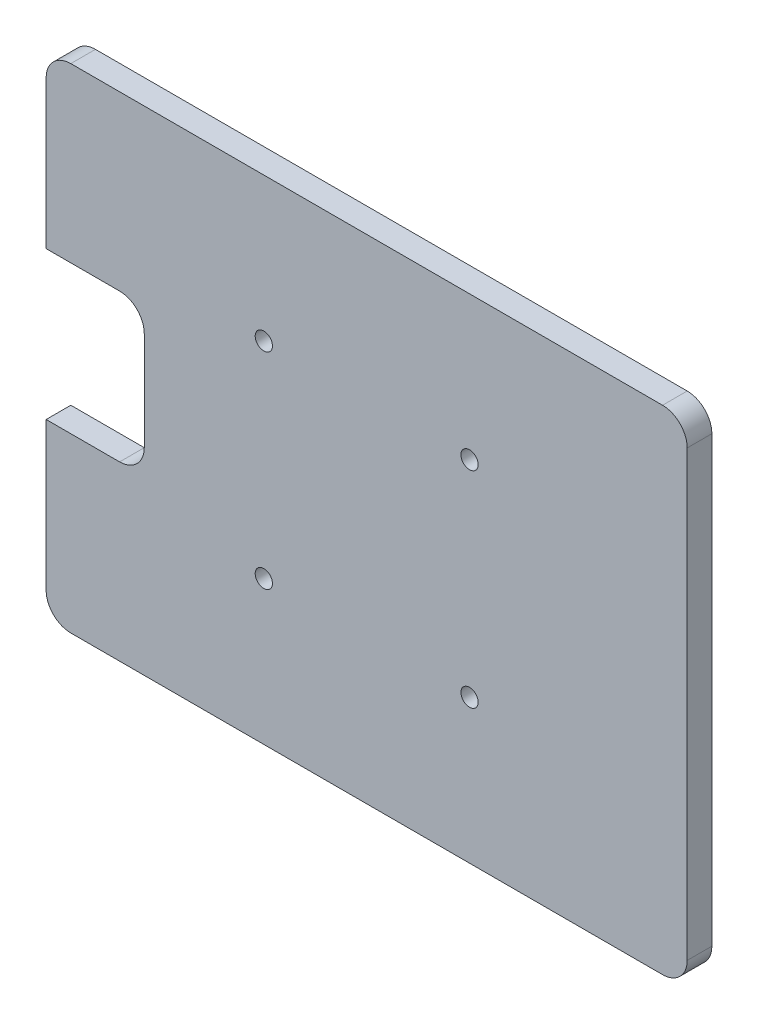
ISO-10303-21;
HEADER;
FILE_DESCRIPTION(('STEP AP214'),'2;1');
FILE_NAME('part.step','',(''),(''),'','','');
FILE_SCHEMA(('AUTOMOTIVE_DESIGN { 1 0 10303 214 1 1 1 1 }'));
ENDSEC;
DATA;
#1=APPLICATION_CONTEXT('core data for automotive mechanical design processes');
#2=APPLICATION_PROTOCOL_DEFINITION('international standard','automotive_design',2000,#1);
#3=PRODUCT_CONTEXT('',#1,'mechanical');
#4=PRODUCT('Part','Part','',(#3));
#5=PRODUCT_RELATED_PRODUCT_CATEGORY('part','',(#4));
#6=PRODUCT_DEFINITION_FORMATION('','',#4);
#7=PRODUCT_DEFINITION_CONTEXT('part definition',#1,'design');
#8=PRODUCT_DEFINITION('design','',#6,#7);
#9=PRODUCT_DEFINITION_SHAPE('','',#8);
#10=(LENGTH_UNIT() NAMED_UNIT(*) SI_UNIT(.MILLI.,.METRE.));
#11=(NAMED_UNIT(*) PLANE_ANGLE_UNIT() SI_UNIT($,.RADIAN.));
#12=(NAMED_UNIT(*) SI_UNIT($,.STERADIAN.) SOLID_ANGLE_UNIT());
#13=UNCERTAINTY_MEASURE_WITH_UNIT(LENGTH_MEASURE(1.E-05),#10,'distance_accuracy_value','');
#14=(GEOMETRIC_REPRESENTATION_CONTEXT(3) GLOBAL_UNCERTAINTY_ASSIGNED_CONTEXT((#13)) GLOBAL_UNIT_ASSIGNED_CONTEXT((#10,
#11,#12)) REPRESENTATION_CONTEXT('',''));
#15=CARTESIAN_POINT('',(0.,0.,0.));
#16=DIRECTION('',(0.,0.,1.));
#17=DIRECTION('',(1.,0.,0.));
#18=AXIS2_PLACEMENT_3D('',#15,#16,#17);
#19=CARTESIAN_POINT('',(-76.008064516129,52.6814516129032,5.));
#20=DIRECTION('',(1.,0.,0.));
#21=DIRECTION('',(0.,0.,-1.));
#22=AXIS2_PLACEMENT_3D('',#19,#20,#21);
#23=PLANE('',#22);
#24=DIRECTION('',(0.,-1.,0.));
#25=VECTOR('',#24,1.);
#26=CARTESIAN_POINT('',(-76.008064516129,52.6814516129032,5.));
#27=LINE('',#26,#25);
#28=CARTESIAN_POINT('',(-76.008064516129,47.6814516129032,5.));
#29=VERTEX_POINT('',#28);
#30=CARTESIAN_POINT('',(-76.008064516129,17.6814516129032,5.));
#31=VERTEX_POINT('',#30);
#32=EDGE_CURVE('E171',#29,#31,#27,.T.);
#33=ORIENTED_EDGE('',*,*,#32,.F.);
#34=DIRECTION('',(0.,0.,-1.));
#35=VECTOR('',#34,1.);
#36=CARTESIAN_POINT('',(-76.008064516129,47.6814516129032,5.));
#37=LINE('',#36,#35);
#38=CARTESIAN_POINT('',(-76.008064516129,47.6814516129032,0.));
#39=VERTEX_POINT('',#38);
#40=EDGE_CURVE('E272',#29,#39,#37,.T.);
#41=ORIENTED_EDGE('',*,*,#40,.T.);
#42=DIRECTION('',(0.,-1.,0.));
#43=VECTOR('',#42,1.);
#44=CARTESIAN_POINT('',(-76.008064516129,52.6814516129032,0.));
#45=LINE('',#44,#43);
#46=CARTESIAN_POINT('',(-76.008064516129,17.6814516129032,0.));
#47=VERTEX_POINT('',#46);
#48=EDGE_CURVE('E192',#39,#47,#45,.T.);
#49=ORIENTED_EDGE('',*,*,#48,.T.);
#50=DIRECTION('',(0.,0.,1.));
#51=VECTOR('',#50,1.);
#52=CARTESIAN_POINT('',(-76.008064516129,17.6814516129032,-5.));
#53=LINE('',#52,#51);
#54=EDGE_CURVE('E153',#47,#31,#53,.T.);
#55=ORIENTED_EDGE('',*,*,#54,.T.);
#56=EDGE_LOOP('',(#33,#41,#49,#55));
#57=FACE_BOUND('',#56,.T.);
#58=ADVANCED_FACE('F38',(#57),#23,.F.);
#59=CARTESIAN_POINT('',(-76.008064516129,-12.3185483870968,0.));
#60=VERTEX_POINT('',#59);
#61=CARTESIAN_POINT('',(-76.008064516129,-42.3185483870968,0.));
#62=VERTEX_POINT('',#61);
#63=EDGE_CURVE('E196',#60,#62,#45,.T.);
#64=ORIENTED_EDGE('',*,*,#63,.T.);
#65=DIRECTION('',(0.,0.,-1.));
#66=VECTOR('',#65,1.);
#67=CARTESIAN_POINT('',(-76.008064516129,-42.3185483870968,5.));
#68=LINE('',#67,#66);
#69=CARTESIAN_POINT('',(-76.008064516129,-42.3185483870968,5.));
#70=VERTEX_POINT('',#69);
#71=EDGE_CURVE('E169',#62,#70,#68,.F.);
#72=ORIENTED_EDGE('',*,*,#71,.T.);
#73=CARTESIAN_POINT('',(-76.008064516129,-12.3185483870968,5.));
#74=VERTEX_POINT('',#73);
#75=EDGE_CURVE('E160',#74,#70,#27,.T.);
#76=ORIENTED_EDGE('',*,*,#75,.F.);
#77=DIRECTION('',(0.,0.,1.));
#78=VECTOR('',#77,1.);
#79=CARTESIAN_POINT('',(-76.008064516129,-12.3185483870968,-5.));
#80=LINE('',#79,#78);
#81=EDGE_CURVE('E141',#60,#74,#80,.T.);
#82=ORIENTED_EDGE('',*,*,#81,.F.);
#83=EDGE_LOOP('',(#64,#72,#76,#82));
#84=FACE_BOUND('',#83,.T.);
#85=ADVANCED_FACE('F167',(#84),#23,.F.);
#86=CARTESIAN_POINT('',(-76.008064516129,-47.3185483870968,5.));
#87=DIRECTION('',(0.,1.,0.));
#88=DIRECTION('',(0.,0.,1.));
#89=AXIS2_PLACEMENT_3D('',#86,#87,#88);
#90=PLANE('',#89);
#91=DIRECTION('',(1.,0.,0.));
#92=VECTOR('',#91,1.);
#93=CARTESIAN_POINT('',(-76.008064516129,-47.3185483870968,0.));
#94=LINE('',#93,#92);
#95=CARTESIAN_POINT('',(-71.008064516129,-47.3185483870968,0.));
#96=VERTEX_POINT('',#95);
#97=CARTESIAN_POINT('',(48.991935483871,-47.3185483870968,0.));
#98=VERTEX_POINT('',#97);
#99=EDGE_CURVE('E195',#96,#98,#94,.T.);
#100=ORIENTED_EDGE('',*,*,#99,.T.);
#101=DIRECTION('',(0.,0.,-1.));
#102=VECTOR('',#101,1.);
#103=CARTESIAN_POINT('',(48.991935483871,-47.3185483870968,5.));
#104=LINE('',#103,#102);
#105=CARTESIAN_POINT('',(48.991935483871,-47.3185483870968,5.));
#106=VERTEX_POINT('',#105);
#107=EDGE_CURVE('E252',#98,#106,#104,.F.);
#108=ORIENTED_EDGE('',*,*,#107,.T.);
#109=DIRECTION('',(1.,0.,0.));
#110=VECTOR('',#109,1.);
#111=CARTESIAN_POINT('',(-76.008064516129,-47.3185483870968,5.));
#112=LINE('',#111,#110);
#113=CARTESIAN_POINT('',(-71.008064516129,-47.3185483870968,5.));
#114=VERTEX_POINT('',#113);
#115=EDGE_CURVE('E176',#114,#106,#112,.T.);
#116=ORIENTED_EDGE('',*,*,#115,.F.);
#117=DIRECTION('',(0.,0.,-1.));
#118=VECTOR('',#117,1.);
#119=CARTESIAN_POINT('',(-71.008064516129,-47.3185483870968,5.));
#120=LINE('',#119,#118);
#121=EDGE_CURVE('E248',#114,#96,#120,.T.);
#122=ORIENTED_EDGE('',*,*,#121,.T.);
#123=EDGE_LOOP('',(#100,#108,#116,#122));
#124=FACE_BOUND('',#123,.T.);
#125=ADVANCED_FACE('F356',(#124),#90,.F.);
#126=CARTESIAN_POINT('',(53.991935483871,52.6814516129032,5.));
#127=DIRECTION('',(-1.,0.,0.));
#128=DIRECTION('',(0.,-1.,0.));
#129=AXIS2_PLACEMENT_3D('',#126,#127,#128);
#130=PLANE('',#129);
#131=DIRECTION('',(0.,1.,0.));
#132=VECTOR('',#131,1.);
#133=CARTESIAN_POINT('',(53.991935483871,52.6814516129032,5.));
#134=LINE('',#133,#132);
#135=CARTESIAN_POINT('',(53.991935483871,-42.3185483870968,5.));
#136=VERTEX_POINT('',#135);
#137=CARTESIAN_POINT('',(53.991935483871,47.6814516129032,5.));
#138=VERTEX_POINT('',#137);
#139=EDGE_CURVE('E185',#136,#138,#134,.T.);
#140=ORIENTED_EDGE('',*,*,#139,.F.);
#141=DIRECTION('',(0.,0.,-1.));
#142=VECTOR('',#141,1.);
#143=CARTESIAN_POINT('',(53.991935483871,-42.3185483870968,5.));
#144=LINE('',#143,#142);
#145=CARTESIAN_POINT('',(53.991935483871,-42.3185483870968,0.));
#146=VERTEX_POINT('',#145);
#147=EDGE_CURVE('E232',#136,#146,#144,.T.);
#148=ORIENTED_EDGE('',*,*,#147,.T.);
#149=DIRECTION('',(0.,1.,0.));
#150=VECTOR('',#149,1.);
#151=CARTESIAN_POINT('',(53.991935483871,52.6814516129032,0.));
#152=LINE('',#151,#150);
#153=CARTESIAN_POINT('',(53.991935483871,47.6814516129032,0.));
#154=VERTEX_POINT('',#153);
#155=EDGE_CURVE('E177',#146,#154,#152,.T.);
#156=ORIENTED_EDGE('',*,*,#155,.T.);
#157=DIRECTION('',(0.,0.,-1.));
#158=VECTOR('',#157,1.);
#159=CARTESIAN_POINT('',(53.991935483871,47.6814516129032,5.));
#160=LINE('',#159,#158);
#161=EDGE_CURVE('E229',#154,#138,#160,.F.);
#162=ORIENTED_EDGE('',*,*,#161,.T.);
#163=EDGE_LOOP('',(#140,#148,#156,#162));
#164=FACE_BOUND('',#163,.T.);
#165=ADVANCED_FACE('F365',(#164),#130,.F.);
#166=CARTESIAN_POINT('',(-76.008064516129,52.6814516129032,5.));
#167=DIRECTION('',(0.,-1.,0.));
#168=DIRECTION('',(0.,0.,-1.));
#169=AXIS2_PLACEMENT_3D('',#166,#167,#168);
#170=PLANE('',#169);
#171=DIRECTION('',(-1.,0.,0.));
#172=VECTOR('',#171,1.);
#173=CARTESIAN_POINT('',(-76.008064516129,52.6814516129032,5.));
#174=LINE('',#173,#172);
#175=CARTESIAN_POINT('',(48.991935483871,52.6814516129032,5.));
#176=VERTEX_POINT('',#175);
#177=CARTESIAN_POINT('',(-71.008064516129,52.6814516129032,5.));
#178=VERTEX_POINT('',#177);
#179=EDGE_CURVE('E189',#176,#178,#174,.T.);
#180=ORIENTED_EDGE('',*,*,#179,.F.);
#181=DIRECTION('',(0.,0.,-1.));
#182=VECTOR('',#181,1.);
#183=CARTESIAN_POINT('',(48.991935483871,52.6814516129032,5.));
#184=LINE('',#183,#182);
#185=CARTESIAN_POINT('',(48.991935483871,52.6814516129032,0.));
#186=VERTEX_POINT('',#185);
#187=EDGE_CURVE('E268',#176,#186,#184,.T.);
#188=ORIENTED_EDGE('',*,*,#187,.T.);
#189=DIRECTION('',(-1.,0.,0.));
#190=VECTOR('',#189,1.);
#191=CARTESIAN_POINT('',(-76.008064516129,52.6814516129032,0.));
#192=LINE('',#191,#190);
#193=CARTESIAN_POINT('',(-71.008064516129,52.6814516129032,0.));
#194=VERTEX_POINT('',#193);
#195=EDGE_CURVE('E172',#186,#194,#192,.T.);
#196=ORIENTED_EDGE('',*,*,#195,.T.);
#197=DIRECTION('',(0.,0.,-1.));
#198=VECTOR('',#197,1.);
#199=CARTESIAN_POINT('',(-71.008064516129,52.6814516129032,5.));
#200=LINE('',#199,#198);
#201=EDGE_CURVE('E62',#194,#178,#200,.F.);
#202=ORIENTED_EDGE('',*,*,#201,.T.);
#203=EDGE_LOOP('',(#180,#188,#196,#202));
#204=FACE_BOUND('',#203,.T.);
#205=ADVANCED_FACE('F342',(#204),#170,.F.);
#206=CARTESIAN_POINT('',(0.,0.,5.));
#207=DIRECTION('',(0.,0.,1.));
#208=DIRECTION('',(1.,0.,0.));
#209=AXIS2_PLACEMENT_3D('',#206,#207,#208);
#210=PLANE('',#209);
#211=ORIENTED_EDGE('',*,*,#115,.T.);
#212=CARTESIAN_POINT('',(48.991935483871,-42.3185483870968,5.));
#213=DIRECTION('',(0.,0.,1.));
#214=DIRECTION('',(1.,0.,0.));
#215=AXIS2_PLACEMENT_3D('',#212,#213,#214);
#216=CIRCLE('',#215,5.);
#217=EDGE_CURVE('E263',#106,#136,#216,.T.);
#218=ORIENTED_EDGE('',*,*,#217,.T.);
#219=ORIENTED_EDGE('',*,*,#139,.T.);
#220=CARTESIAN_POINT('',(48.991935483871,47.6814516129032,5.));
#221=DIRECTION('',(0.,0.,1.));
#222=DIRECTION('',(1.,0.,0.));
#223=AXIS2_PLACEMENT_3D('',#220,#221,#222);
#224=CIRCLE('',#223,5.);
#225=EDGE_CURVE('E260',#138,#176,#224,.T.);
#226=ORIENTED_EDGE('',*,*,#225,.T.);
#227=ORIENTED_EDGE('',*,*,#179,.T.);
#228=CARTESIAN_POINT('',(-71.008064516129,47.6814516129032,5.));
#229=DIRECTION('',(0.,0.,1.));
#230=DIRECTION('',(1.,0.,0.));
#231=AXIS2_PLACEMENT_3D('',#228,#229,#230);
#232=CIRCLE('',#231,5.);
#233=EDGE_CURVE('E54',#178,#29,#232,.T.);
#234=ORIENTED_EDGE('',*,*,#233,.T.);
#235=ORIENTED_EDGE('',*,*,#32,.T.);
#236=DIRECTION('',(-1.,0.,0.));
#237=VECTOR('',#236,1.);
#238=CARTESIAN_POINT('',(-76.008064516129,17.6814516129032,5.));
#239=LINE('',#238,#237);
#240=CARTESIAN_POINT('',(-61.1075368254289,17.6814516129032,5.));
#241=VERTEX_POINT('',#240);
#242=EDGE_CURVE('E154',#241,#31,#239,.T.);
#243=ORIENTED_EDGE('',*,*,#242,.F.);
#244=CARTESIAN_POINT('',(-61.1075368254289,12.6814516129032,5.));
#245=DIRECTION('',(0.,0.,1.));
#246=DIRECTION('',(1.,0.,0.));
#247=AXIS2_PLACEMENT_3D('',#244,#245,#246);
#248=CIRCLE('',#247,5.);
#249=CARTESIAN_POINT('',(-56.1075368254289,12.6814516129032,5.));
#250=VERTEX_POINT('',#249);
#251=EDGE_CURVE('E47',#241,#250,#248,.F.);
#252=ORIENTED_EDGE('',*,*,#251,.T.);
#253=DIRECTION('',(0.,1.,0.));
#254=VECTOR('',#253,1.);
#255=CARTESIAN_POINT('',(-56.1075368254289,17.6814516129032,5.));
#256=LINE('',#255,#254);
#257=CARTESIAN_POINT('',(-56.1075368254289,-7.31854838709675,5.));
#258=VERTEX_POINT('',#257);
#259=EDGE_CURVE('E165',#258,#250,#256,.T.);
#260=ORIENTED_EDGE('',*,*,#259,.F.);
#261=CARTESIAN_POINT('',(-61.1075368254289,-7.31854838709676,5.));
#262=DIRECTION('',(0.,0.,1.));
#263=DIRECTION('',(1.,0.,0.));
#264=AXIS2_PLACEMENT_3D('',#261,#262,#263);
#265=CIRCLE('',#264,5.);
#266=CARTESIAN_POINT('',(-61.1075368254289,-12.3185483870968,5.));
#267=VERTEX_POINT('',#266);
#268=EDGE_CURVE('E163',#258,#267,#265,.F.);
#269=ORIENTED_EDGE('',*,*,#268,.T.);
#270=DIRECTION('',(1.,0.,0.));
#271=VECTOR('',#270,1.);
#272=CARTESIAN_POINT('',(-76.008064516129,-12.3185483870968,5.));
#273=LINE('',#272,#271);
#274=EDGE_CURVE('E144',#74,#267,#273,.T.);
#275=ORIENTED_EDGE('',*,*,#274,.F.);
#276=ORIENTED_EDGE('',*,*,#75,.T.);
#277=CARTESIAN_POINT('',(-71.008064516129,-42.3185483870968,5.));
#278=DIRECTION('',(0.,0.,1.));
#279=DIRECTION('',(1.,0.,0.));
#280=AXIS2_PLACEMENT_3D('',#277,#278,#279);
#281=CIRCLE('',#280,5.);
#282=EDGE_CURVE('E255',#70,#114,#281,.T.);
#283=ORIENTED_EDGE('',*,*,#282,.T.);
#284=EDGE_LOOP('',(#211,#218,#219,#226,#227,#234,#235,#243,#252,#260,#269,#275,#276,#283));
#285=FACE_BOUND('',#284,.T.);
#286=CARTESIAN_POINT('',(-31.8677145611318,-18.1781984321003,5.));
#287=DIRECTION('',(0.,0.,1.));
#288=DIRECTION('',(1.,0.,0.));
#289=AXIS2_PLACEMENT_3D('',#286,#287,#288);
#290=CIRCLE('',#289,1.74999999999953);
#291=CARTESIAN_POINT('',(-30.1177145611322,-18.1781984321003,5.));
#292=VERTEX_POINT('',#291);
#293=EDGE_CURVE('E322',#292,#292,#290,.T.);
#294=ORIENTED_EDGE('',*,*,#293,.F.);
#295=EDGE_LOOP('',(#294));
#296=FACE_BOUND('',#295,.T.);
#297=CARTESIAN_POINT('',(9.85158552887461,-18.1781984320994,5.));
#298=DIRECTION('',(0.,0.,1.));
#299=DIRECTION('',(1.,0.,0.));
#300=AXIS2_PLACEMENT_3D('',#297,#298,#299);
#301=CIRCLE('',#300,1.74999999999953);
#302=CARTESIAN_POINT('',(11.6015855288741,-18.1781984320994,5.));
#303=VERTEX_POINT('',#302);
#304=EDGE_CURVE('E326',#303,#303,#301,.T.);
#305=ORIENTED_EDGE('',*,*,#304,.F.);
#306=EDGE_LOOP('',(#305));
#307=FACE_BOUND('',#306,.T.);
#308=CARTESIAN_POINT('',(9.85158552887386,23.5411016579067,5.));
#309=DIRECTION('',(0.,0.,1.));
#310=DIRECTION('',(1.,0.,0.));
#311=AXIS2_PLACEMENT_3D('',#308,#309,#310);
#312=CIRCLE('',#311,1.74999999999953);
#313=CARTESIAN_POINT('',(11.6015855288734,23.5411016579067,5.));
#314=VERTEX_POINT('',#313);
#315=EDGE_CURVE('E329',#314,#314,#312,.T.);
#316=ORIENTED_EDGE('',*,*,#315,.F.);
#317=EDGE_LOOP('',(#316));
#318=FACE_BOUND('',#317,.T.);
#319=CARTESIAN_POINT('',(-31.8677145611325,23.541101657906,5.));
#320=DIRECTION('',(0.,0.,1.));
#321=DIRECTION('',(1.,0.,0.));
#322=AXIS2_PLACEMENT_3D('',#319,#320,#321);
#323=CIRCLE('',#322,1.74999999999953);
#324=CARTESIAN_POINT('',(-30.117714561133,23.541101657906,5.));
#325=VERTEX_POINT('',#324);
#326=EDGE_CURVE('E181',#325,#325,#323,.T.);
#327=ORIENTED_EDGE('',*,*,#326,.F.);
#328=EDGE_LOOP('',(#327));
#329=FACE_BOUND('',#328,.T.);
#330=ADVANCED_FACE('F158',(#285,#296,#307,#318,#329),#210,.T.);
#331=CARTESIAN_POINT('',(0.,0.,0.));
#332=DIRECTION('',(0.,0.,1.));
#333=DIRECTION('',(1.,0.,0.));
#334=AXIS2_PLACEMENT_3D('',#331,#332,#333);
#335=PLANE('',#334);
#336=CARTESIAN_POINT('',(-31.8677145611318,-18.1781984321003,0.));
#337=DIRECTION('',(0.,0.,1.));
#338=DIRECTION('',(1.,0.,0.));
#339=AXIS2_PLACEMENT_3D('',#336,#337,#338);
#340=CIRCLE('',#339,1.74999999999953);
#341=CARTESIAN_POINT('',(-30.1177145611322,-18.1781984321003,0.));
#342=VERTEX_POINT('',#341);
#343=EDGE_CURVE('E215',#342,#342,#340,.T.);
#344=ORIENTED_EDGE('',*,*,#343,.T.);
#345=EDGE_LOOP('',(#344));
#346=FACE_BOUND('',#345,.T.);
#347=CARTESIAN_POINT('',(9.85158552887461,-18.1781984320994,0.));
#348=DIRECTION('',(0.,0.,1.));
#349=DIRECTION('',(1.,0.,0.));
#350=AXIS2_PLACEMENT_3D('',#347,#348,#349);
#351=CIRCLE('',#350,1.74999999999953);
#352=CARTESIAN_POINT('',(11.6015855288741,-18.1781984320994,0.));
#353=VERTEX_POINT('',#352);
#354=EDGE_CURVE('E211',#353,#353,#351,.T.);
#355=ORIENTED_EDGE('',*,*,#354,.T.);
#356=EDGE_LOOP('',(#355));
#357=FACE_BOUND('',#356,.T.);
#358=CARTESIAN_POINT('',(9.85158552887386,23.5411016579067,0.));
#359=DIRECTION('',(0.,0.,1.));
#360=DIRECTION('',(1.,0.,0.));
#361=AXIS2_PLACEMENT_3D('',#358,#359,#360);
#362=CIRCLE('',#361,1.74999999999953);
#363=CARTESIAN_POINT('',(11.6015855288734,23.5411016579067,0.));
#364=VERTEX_POINT('',#363);
#365=EDGE_CURVE('E207',#364,#364,#362,.T.);
#366=ORIENTED_EDGE('',*,*,#365,.T.);
#367=EDGE_LOOP('',(#366));
#368=FACE_BOUND('',#367,.T.);
#369=CARTESIAN_POINT('',(-31.8677145611325,23.541101657906,0.));
#370=DIRECTION('',(0.,0.,1.));
#371=DIRECTION('',(1.,0.,0.));
#372=AXIS2_PLACEMENT_3D('',#369,#370,#371);
#373=CIRCLE('',#372,1.74999999999953);
#374=CARTESIAN_POINT('',(-30.117714561133,23.541101657906,0.));
#375=VERTEX_POINT('',#374);
#376=EDGE_CURVE('E203',#375,#375,#373,.T.);
#377=ORIENTED_EDGE('',*,*,#376,.T.);
#378=EDGE_LOOP('',(#377));
#379=FACE_BOUND('',#378,.T.);
#380=ORIENTED_EDGE('',*,*,#155,.F.);
#381=CARTESIAN_POINT('',(48.991935483871,-42.3185483870968,0.));
#382=DIRECTION('',(0.,0.,1.));
#383=DIRECTION('',(1.,0.,0.));
#384=AXIS2_PLACEMENT_3D('',#381,#382,#383);
#385=CIRCLE('',#384,5.);
#386=EDGE_CURVE('E245',#146,#98,#385,.F.);
#387=ORIENTED_EDGE('',*,*,#386,.T.);
#388=ORIENTED_EDGE('',*,*,#99,.F.);
#389=CARTESIAN_POINT('',(-71.008064516129,-42.3185483870968,0.));
#390=DIRECTION('',(0.,0.,1.));
#391=DIRECTION('',(1.,0.,0.));
#392=AXIS2_PLACEMENT_3D('',#389,#390,#391);
#393=CIRCLE('',#392,5.);
#394=EDGE_CURVE('E236',#96,#62,#393,.F.);
#395=ORIENTED_EDGE('',*,*,#394,.T.);
#396=ORIENTED_EDGE('',*,*,#63,.F.);
#397=DIRECTION('',(1.,0.,0.));
#398=VECTOR('',#397,1.);
#399=CARTESIAN_POINT('',(0.,-12.3185483870968,0.));
#400=LINE('',#399,#398);
#401=CARTESIAN_POINT('',(-61.1075368254289,-12.3185483870968,0.));
#402=VERTEX_POINT('',#401);
#403=EDGE_CURVE('E147',#60,#402,#400,.T.);
#404=ORIENTED_EDGE('',*,*,#403,.T.);
#405=CARTESIAN_POINT('',(-61.1075368254289,-7.31854838709676,0.));
#406=DIRECTION('',(0.,0.,1.));
#407=DIRECTION('',(1.,0.,0.));
#408=AXIS2_PLACEMENT_3D('',#405,#406,#407);
#409=CIRCLE('',#408,5.);
#410=CARTESIAN_POINT('',(-56.1075368254289,-7.31854838709675,0.));
#411=VERTEX_POINT('',#410);
#412=EDGE_CURVE('E294',#402,#411,#409,.T.);
#413=ORIENTED_EDGE('',*,*,#412,.T.);
#414=DIRECTION('',(0.,1.,0.));
#415=VECTOR('',#414,1.);
#416=CARTESIAN_POINT('',(-56.1075368254289,0.,0.));
#417=LINE('',#416,#415);
#418=CARTESIAN_POINT('',(-56.1075368254289,12.6814516129032,0.));
#419=VERTEX_POINT('',#418);
#420=EDGE_CURVE('E221',#411,#419,#417,.T.);
#421=ORIENTED_EDGE('',*,*,#420,.T.);
#422=CARTESIAN_POINT('',(-61.1075368254289,12.6814516129032,0.));
#423=DIRECTION('',(0.,0.,1.));
#424=DIRECTION('',(1.,0.,0.));
#425=AXIS2_PLACEMENT_3D('',#422,#423,#424);
#426=CIRCLE('',#425,5.);
#427=CARTESIAN_POINT('',(-61.1075368254289,17.6814516129032,0.));
#428=VERTEX_POINT('',#427);
#429=EDGE_CURVE('E11',#419,#428,#426,.T.);
#430=ORIENTED_EDGE('',*,*,#429,.T.);
#431=DIRECTION('',(-1.,0.,0.));
#432=VECTOR('',#431,1.);
#433=CARTESIAN_POINT('',(0.,17.6814516129032,0.));
#434=LINE('',#433,#432);
#435=EDGE_CURVE('E225',#428,#47,#434,.T.);
#436=ORIENTED_EDGE('',*,*,#435,.T.);
#437=ORIENTED_EDGE('',*,*,#48,.F.);
#438=CARTESIAN_POINT('',(-71.008064516129,47.6814516129032,0.));
#439=DIRECTION('',(0.,0.,1.));
#440=DIRECTION('',(1.,0.,0.));
#441=AXIS2_PLACEMENT_3D('',#438,#439,#440);
#442=CIRCLE('',#441,5.);
#443=EDGE_CURVE('E239',#39,#194,#442,.F.);
#444=ORIENTED_EDGE('',*,*,#443,.T.);
#445=ORIENTED_EDGE('',*,*,#195,.F.);
#446=CARTESIAN_POINT('',(48.991935483871,47.6814516129032,0.));
#447=DIRECTION('',(0.,0.,1.));
#448=DIRECTION('',(1.,0.,0.));
#449=AXIS2_PLACEMENT_3D('',#446,#447,#448);
#450=CIRCLE('',#449,5.);
#451=EDGE_CURVE('E242',#186,#154,#450,.F.);
#452=ORIENTED_EDGE('',*,*,#451,.T.);
#453=EDGE_LOOP('',(#380,#387,#388,#395,#396,#404,#413,#421,#430,#436,#437,#444,#445,#452));
#454=FACE_BOUND('',#453,.T.);
#455=ADVANCED_FACE('F314',(#346,#357,#368,#379,#454),#335,.F.);
#456=CARTESIAN_POINT('',(-31.8677145611325,23.541101657906,-5.));
#457=DIRECTION('',(0.,0.,1.));
#458=DIRECTION('',(1.,0.,0.));
#459=AXIS2_PLACEMENT_3D('',#456,#457,#458);
#460=CYLINDRICAL_SURFACE('',#459,1.74999999999953);
#461=ORIENTED_EDGE('',*,*,#326,.T.);
#462=EDGE_LOOP('',(#461));
#463=FACE_BOUND('',#462,.T.);
#464=ORIENTED_EDGE('',*,*,#376,.F.);
#465=EDGE_LOOP('',(#464));
#466=FACE_BOUND('',#465,.T.);
#467=ADVANCED_FACE('F453',(#463,#466),#460,.F.);
#468=CARTESIAN_POINT('',(9.85158552887386,23.5411016579067,-5.));
#469=DIRECTION('',(0.,0.,1.));
#470=DIRECTION('',(1.,0.,0.));
#471=AXIS2_PLACEMENT_3D('',#468,#469,#470);
#472=CYLINDRICAL_SURFACE('',#471,1.74999999999953);
#473=ORIENTED_EDGE('',*,*,#315,.T.);
#474=EDGE_LOOP('',(#473));
#475=FACE_BOUND('',#474,.T.);
#476=ORIENTED_EDGE('',*,*,#365,.F.);
#477=EDGE_LOOP('',(#476));
#478=FACE_BOUND('',#477,.T.);
#479=ADVANCED_FACE('F507',(#475,#478),#472,.F.);
#480=CARTESIAN_POINT('',(9.85158552887461,-18.1781984320994,-5.));
#481=DIRECTION('',(0.,0.,1.));
#482=DIRECTION('',(1.,0.,0.));
#483=AXIS2_PLACEMENT_3D('',#480,#481,#482);
#484=CYLINDRICAL_SURFACE('',#483,1.74999999999953);
#485=ORIENTED_EDGE('',*,*,#304,.T.);
#486=EDGE_LOOP('',(#485));
#487=FACE_BOUND('',#486,.T.);
#488=ORIENTED_EDGE('',*,*,#354,.F.);
#489=EDGE_LOOP('',(#488));
#490=FACE_BOUND('',#489,.T.);
#491=ADVANCED_FACE('F337',(#487,#490),#484,.F.);
#492=CARTESIAN_POINT('',(-31.8677145611318,-18.1781984321003,-5.));
#493=DIRECTION('',(0.,0.,1.));
#494=DIRECTION('',(1.,0.,0.));
#495=AXIS2_PLACEMENT_3D('',#492,#493,#494);
#496=CYLINDRICAL_SURFACE('',#495,1.74999999999953);
#497=ORIENTED_EDGE('',*,*,#293,.T.);
#498=EDGE_LOOP('',(#497));
#499=FACE_BOUND('',#498,.T.);
#500=ORIENTED_EDGE('',*,*,#343,.F.);
#501=EDGE_LOOP('',(#500));
#502=FACE_BOUND('',#501,.T.);
#503=ADVANCED_FACE('F446',(#499,#502),#496,.F.);
#504=CARTESIAN_POINT('',(-76.008064516129,17.6814516129032,-5.));
#505=DIRECTION('',(0.,1.,0.));
#506=DIRECTION('',(0.,0.,1.));
#507=AXIS2_PLACEMENT_3D('',#504,#505,#506);
#508=PLANE('',#507);
#509=ORIENTED_EDGE('',*,*,#435,.F.);
#510=DIRECTION('',(0.,0.,1.));
#511=VECTOR('',#510,1.);
#512=CARTESIAN_POINT('',(-61.1075368254289,17.6814516129032,5.));
#513=LINE('',#512,#511);
#514=EDGE_CURVE('E286',#428,#241,#513,.T.);
#515=ORIENTED_EDGE('',*,*,#514,.T.);
#516=ORIENTED_EDGE('',*,*,#242,.T.);
#517=ORIENTED_EDGE('',*,*,#54,.F.);
#518=EDGE_LOOP('',(#509,#515,#516,#517));
#519=FACE_BOUND('',#518,.T.);
#520=ADVANCED_FACE('F318',(#519),#508,.F.);
#521=CARTESIAN_POINT('',(-56.1075368254289,17.6814516129032,-5.));
#522=DIRECTION('',(1.,0.,0.));
#523=DIRECTION('',(0.,1.,0.));
#524=AXIS2_PLACEMENT_3D('',#521,#522,#523);
#525=PLANE('',#524);
#526=ORIENTED_EDGE('',*,*,#420,.F.);
#527=DIRECTION('',(0.,0.,1.));
#528=VECTOR('',#527,1.);
#529=CARTESIAN_POINT('',(-56.1075368254289,-7.31854838709675,5.));
#530=LINE('',#529,#528);
#531=EDGE_CURVE('E279',#411,#258,#530,.T.);
#532=ORIENTED_EDGE('',*,*,#531,.T.);
#533=ORIENTED_EDGE('',*,*,#259,.T.);
#534=DIRECTION('',(0.,0.,1.));
#535=VECTOR('',#534,1.);
#536=CARTESIAN_POINT('',(-56.1075368254289,12.6814516129032,0.));
#537=LINE('',#536,#535);
#538=EDGE_CURVE('E276',#250,#419,#537,.F.);
#539=ORIENTED_EDGE('',*,*,#538,.T.);
#540=EDGE_LOOP('',(#526,#532,#533,#539));
#541=FACE_BOUND('',#540,.T.);
#542=ADVANCED_FACE('F305',(#541),#525,.F.);
#543=CARTESIAN_POINT('',(-76.008064516129,-12.3185483870968,-5.));
#544=DIRECTION('',(0.,-1.,0.));
#545=DIRECTION('',(1.,0.,0.));
#546=AXIS2_PLACEMENT_3D('',#543,#544,#545);
#547=PLANE('',#546);
#548=ORIENTED_EDGE('',*,*,#274,.T.);
#549=DIRECTION('',(0.,0.,1.));
#550=VECTOR('',#549,1.);
#551=CARTESIAN_POINT('',(-61.1075368254289,-12.3185483870968,0.));
#552=LINE('',#551,#550);
#553=EDGE_CURVE('E283',#267,#402,#552,.F.);
#554=ORIENTED_EDGE('',*,*,#553,.T.);
#555=ORIENTED_EDGE('',*,*,#403,.F.);
#556=ORIENTED_EDGE('',*,*,#81,.T.);
#557=EDGE_LOOP('',(#548,#554,#555,#556));
#558=FACE_BOUND('',#557,.T.);
#559=ADVANCED_FACE('F143',(#558),#547,.F.);
#560=CARTESIAN_POINT('',(48.991935483871,-42.3185483870968,5.));
#561=DIRECTION('',(0.,0.,-1.));
#562=DIRECTION('',(-1.,0.,0.));
#563=AXIS2_PLACEMENT_3D('',#560,#561,#562);
#564=CYLINDRICAL_SURFACE('',#563,5.);
#565=ORIENTED_EDGE('',*,*,#217,.F.);
#566=ORIENTED_EDGE('',*,*,#107,.F.);
#567=ORIENTED_EDGE('',*,*,#386,.F.);
#568=ORIENTED_EDGE('',*,*,#147,.F.);
#569=EDGE_LOOP('',(#565,#566,#567,#568));
#570=FACE_BOUND('',#569,.T.);
#571=ADVANCED_FACE('F360',(#570),#564,.T.);
#572=CARTESIAN_POINT('',(48.991935483871,47.6814516129032,5.));
#573=DIRECTION('',(0.,0.,-1.));
#574=DIRECTION('',(-1.,0.,0.));
#575=AXIS2_PLACEMENT_3D('',#572,#573,#574);
#576=CYLINDRICAL_SURFACE('',#575,5.);
#577=ORIENTED_EDGE('',*,*,#225,.F.);
#578=ORIENTED_EDGE('',*,*,#161,.F.);
#579=ORIENTED_EDGE('',*,*,#451,.F.);
#580=ORIENTED_EDGE('',*,*,#187,.F.);
#581=EDGE_LOOP('',(#577,#578,#579,#580));
#582=FACE_BOUND('',#581,.T.);
#583=ADVANCED_FACE('F368',(#582),#576,.T.);
#584=CARTESIAN_POINT('',(-71.008064516129,47.6814516129032,5.));
#585=DIRECTION('',(0.,0.,-1.));
#586=DIRECTION('',(-1.,0.,0.));
#587=AXIS2_PLACEMENT_3D('',#584,#585,#586);
#588=CYLINDRICAL_SURFACE('',#587,5.);
#589=ORIENTED_EDGE('',*,*,#233,.F.);
#590=ORIENTED_EDGE('',*,*,#201,.F.);
#591=ORIENTED_EDGE('',*,*,#443,.F.);
#592=ORIENTED_EDGE('',*,*,#40,.F.);
#593=EDGE_LOOP('',(#589,#590,#591,#592));
#594=FACE_BOUND('',#593,.T.);
#595=ADVANCED_FACE('F373',(#594),#588,.T.);
#596=CARTESIAN_POINT('',(-61.1075368254289,-7.31854838709676,-5.));
#597=DIRECTION('',(0.,0.,-1.));
#598=DIRECTION('',(-1.,0.,0.));
#599=AXIS2_PLACEMENT_3D('',#596,#597,#598);
#600=CYLINDRICAL_SURFACE('',#599,5.);
#601=ORIENTED_EDGE('',*,*,#412,.F.);
#602=ORIENTED_EDGE('',*,*,#553,.F.);
#603=ORIENTED_EDGE('',*,*,#268,.F.);
#604=ORIENTED_EDGE('',*,*,#531,.F.);
#605=EDGE_LOOP('',(#601,#602,#603,#604));
#606=FACE_BOUND('',#605,.T.);
#607=ADVANCED_FACE('F389',(#606),#600,.F.);
#608=CARTESIAN_POINT('',(-61.1075368254289,12.6814516129032,-5.));
#609=DIRECTION('',(0.,0.,-1.));
#610=DIRECTION('',(-1.,0.,0.));
#611=AXIS2_PLACEMENT_3D('',#608,#609,#610);
#612=CYLINDRICAL_SURFACE('',#611,5.);
#613=ORIENTED_EDGE('',*,*,#429,.F.);
#614=ORIENTED_EDGE('',*,*,#538,.F.);
#615=ORIENTED_EDGE('',*,*,#251,.F.);
#616=ORIENTED_EDGE('',*,*,#514,.F.);
#617=EDGE_LOOP('',(#613,#614,#615,#616));
#618=FACE_BOUND('',#617,.T.);
#619=ADVANCED_FACE('F310',(#618),#612,.F.);
#620=CARTESIAN_POINT('',(-71.008064516129,-42.3185483870968,5.));
#621=DIRECTION('',(0.,0.,-1.));
#622=DIRECTION('',(-1.,0.,0.));
#623=AXIS2_PLACEMENT_3D('',#620,#621,#622);
#624=CYLINDRICAL_SURFACE('',#623,5.);
#625=ORIENTED_EDGE('',*,*,#282,.F.);
#626=ORIENTED_EDGE('',*,*,#71,.F.);
#627=ORIENTED_EDGE('',*,*,#394,.F.);
#628=ORIENTED_EDGE('',*,*,#121,.F.);
#629=EDGE_LOOP('',(#625,#626,#627,#628));
#630=FACE_BOUND('',#629,.T.);
#631=ADVANCED_FACE('F40',(#630),#624,.T.);
#632=CLOSED_SHELL('',(#58,#85,#125,#165,#205,#330,#455,#467,#479,#491,#503,#520,#542,#559,#571,
#583,#595,#607,#619,#631));
#633=MANIFOLD_SOLID_BREP('B2',#632);
#634=ADVANCED_BREP_SHAPE_REPRESENTATION('',(#18,#633),#14);
#635=SHAPE_DEFINITION_REPRESENTATION(#9,#634);
ENDSEC;
END-ISO-10303-21;
